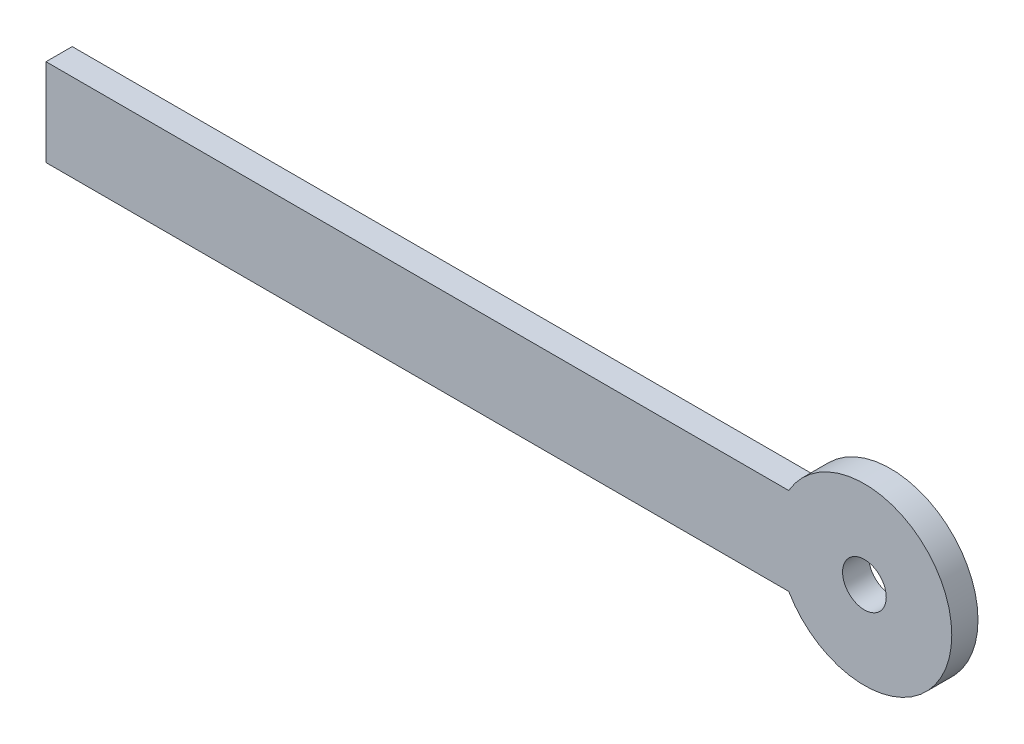
ISO-10303-21;
HEADER;
FILE_DESCRIPTION(('STEP AP214'),'2;1');
FILE_NAME('part.step','',(''),(''),'','','');
FILE_SCHEMA(('AUTOMOTIVE_DESIGN { 1 0 10303 214 1 1 1 1 }'));
ENDSEC;
DATA;
#1=APPLICATION_CONTEXT('core data for automotive mechanical design processes');
#2=APPLICATION_PROTOCOL_DEFINITION('international standard','automotive_design',2000,#1);
#3=PRODUCT_CONTEXT('',#1,'mechanical');
#4=PRODUCT('Part','Part','',(#3));
#5=PRODUCT_RELATED_PRODUCT_CATEGORY('part','',(#4));
#6=PRODUCT_DEFINITION_FORMATION('','',#4);
#7=PRODUCT_DEFINITION_CONTEXT('part definition',#1,'design');
#8=PRODUCT_DEFINITION('design','',#6,#7);
#9=PRODUCT_DEFINITION_SHAPE('','',#8);
#10=(LENGTH_UNIT() NAMED_UNIT(*) SI_UNIT(.MILLI.,.METRE.));
#11=(NAMED_UNIT(*) PLANE_ANGLE_UNIT() SI_UNIT($,.RADIAN.));
#12=(NAMED_UNIT(*) SI_UNIT($,.STERADIAN.) SOLID_ANGLE_UNIT());
#13=UNCERTAINTY_MEASURE_WITH_UNIT(LENGTH_MEASURE(1.E-05),#10,'distance_accuracy_value','');
#14=(GEOMETRIC_REPRESENTATION_CONTEXT(3) GLOBAL_UNCERTAINTY_ASSIGNED_CONTEXT((#13)) GLOBAL_UNIT_ASSIGNED_CONTEXT((#10,
#11,#12)) REPRESENTATION_CONTEXT('',''));
#15=CARTESIAN_POINT('',(0.,0.,0.));
#16=DIRECTION('',(0.,0.,1.));
#17=DIRECTION('',(1.,0.,0.));
#18=AXIS2_PLACEMENT_3D('',#15,#16,#17);
#19=CARTESIAN_POINT('',(0.,0.,3.));
#20=DIRECTION('',(0.,0.,1.));
#21=DIRECTION('',(1.,0.,0.));
#22=AXIS2_PLACEMENT_3D('',#19,#20,#21);
#23=PLANE('',#22);
#24=DIRECTION('',(0.,-1.,0.));
#25=VECTOR('',#24,1.);
#26=CARTESIAN_POINT('',(-93.6602540378444,4.99999999999999,3.));
#27=LINE('',#26,#25);
#28=CARTESIAN_POINT('',(-93.6602540378444,4.99999999999999,3.));
#29=VERTEX_POINT('',#28);
#30=CARTESIAN_POINT('',(-93.6602540378444,-5.00000000000001,3.));
#31=VERTEX_POINT('',#30);
#32=EDGE_CURVE('E85',#29,#31,#27,.T.);
#33=ORIENTED_EDGE('',*,*,#32,.T.);
#34=DIRECTION('',(1.,0.,0.));
#35=VECTOR('',#34,1.);
#36=CARTESIAN_POINT('',(-93.6602540378444,-5.00000000000001,3.));
#37=LINE('',#36,#35);
#38=CARTESIAN_POINT('',(-8.66025403784438,-5.,3.));
#39=VERTEX_POINT('',#38);
#40=EDGE_CURVE('E80',#31,#39,#37,.T.);
#41=ORIENTED_EDGE('',*,*,#40,.T.);
#42=CARTESIAN_POINT('',(0.,0.,3.));
#43=DIRECTION('',(0.,0.,1.));
#44=DIRECTION('',(1.,0.,0.));
#45=AXIS2_PLACEMENT_3D('',#42,#43,#44);
#46=CIRCLE('',#45,10.);
#47=CARTESIAN_POINT('',(-8.66025403784439,4.99999999999999,3.));
#48=VERTEX_POINT('',#47);
#49=EDGE_CURVE('E83',#39,#48,#46,.T.);
#50=ORIENTED_EDGE('',*,*,#49,.T.);
#51=DIRECTION('',(-1.,0.,0.));
#52=VECTOR('',#51,1.);
#53=CARTESIAN_POINT('',(-93.6602540378444,4.99999999999999,3.));
#54=LINE('',#53,#52);
#55=EDGE_CURVE('E50',#48,#29,#54,.T.);
#56=ORIENTED_EDGE('',*,*,#55,.T.);
#57=EDGE_LOOP('',(#33,#41,#50,#56));
#58=FACE_BOUND('',#57,.T.);
#59=CARTESIAN_POINT('',(0.,0.,3.));
#60=DIRECTION('',(0.,0.,1.));
#61=DIRECTION('',(1.,0.,0.));
#62=AXIS2_PLACEMENT_3D('',#59,#60,#61);
#63=CIRCLE('',#62,2.5);
#64=CARTESIAN_POINT('',(2.5,0.,3.));
#65=VERTEX_POINT('',#64);
#66=EDGE_CURVE('E100',#65,#65,#63,.T.);
#67=ORIENTED_EDGE('',*,*,#66,.F.);
#68=EDGE_LOOP('',(#67));
#69=FACE_BOUND('',#68,.T.);
#70=ADVANCED_FACE('F33',(#58,#69),#23,.T.);
#71=CARTESIAN_POINT('',(0.,0.,0.));
#72=DIRECTION('',(0.,0.,1.));
#73=DIRECTION('',(1.,0.,0.));
#74=AXIS2_PLACEMENT_3D('',#71,#72,#73);
#75=PLANE('',#74);
#76=DIRECTION('',(0.,-1.,0.));
#77=VECTOR('',#76,1.);
#78=CARTESIAN_POINT('',(-93.6602540378444,4.99999999999999,0.));
#79=LINE('',#78,#77);
#80=CARTESIAN_POINT('',(-93.6602540378444,4.99999999999999,0.));
#81=VERTEX_POINT('',#80);
#82=CARTESIAN_POINT('',(-93.6602540378444,-5.00000000000001,0.));
#83=VERTEX_POINT('',#82);
#84=EDGE_CURVE('E97',#81,#83,#79,.T.);
#85=ORIENTED_EDGE('',*,*,#84,.F.);
#86=DIRECTION('',(-1.,0.,0.));
#87=VECTOR('',#86,1.);
#88=CARTESIAN_POINT('',(-93.6602540378444,4.99999999999999,0.));
#89=LINE('',#88,#87);
#90=CARTESIAN_POINT('',(-8.66025403784439,4.99999999999999,0.));
#91=VERTEX_POINT('',#90);
#92=EDGE_CURVE('E73',#91,#81,#89,.T.);
#93=ORIENTED_EDGE('',*,*,#92,.F.);
#94=CARTESIAN_POINT('',(0.,0.,0.));
#95=DIRECTION('',(0.,0.,1.));
#96=DIRECTION('',(1.,0.,0.));
#97=AXIS2_PLACEMENT_3D('',#94,#95,#96);
#98=CIRCLE('',#97,10.);
#99=CARTESIAN_POINT('',(-8.66025403784438,-5.,0.));
#100=VERTEX_POINT('',#99);
#101=EDGE_CURVE('E67',#100,#91,#98,.T.);
#102=ORIENTED_EDGE('',*,*,#101,.F.);
#103=DIRECTION('',(1.,0.,0.));
#104=VECTOR('',#103,1.);
#105=CARTESIAN_POINT('',(-93.6602540378444,-5.00000000000001,0.));
#106=LINE('',#105,#104);
#107=EDGE_CURVE('E89',#83,#100,#106,.T.);
#108=ORIENTED_EDGE('',*,*,#107,.F.);
#109=EDGE_LOOP('',(#85,#93,#102,#108));
#110=FACE_BOUND('',#109,.T.);
#111=CARTESIAN_POINT('',(0.,0.,0.));
#112=DIRECTION('',(0.,0.,1.));
#113=DIRECTION('',(1.,0.,0.));
#114=AXIS2_PLACEMENT_3D('',#111,#112,#113);
#115=CIRCLE('',#114,2.5);
#116=CARTESIAN_POINT('',(2.5,0.,0.));
#117=VERTEX_POINT('',#116);
#118=EDGE_CURVE('E112',#117,#117,#115,.T.);
#119=ORIENTED_EDGE('',*,*,#118,.T.);
#120=EDGE_LOOP('',(#119));
#121=FACE_BOUND('',#120,.T.);
#122=ADVANCED_FACE('F108',(#110,#121),#75,.F.);
#123=CARTESIAN_POINT('',(-93.6602540378444,4.99999999999999,3.));
#124=DIRECTION('',(1.,0.,0.));
#125=DIRECTION('',(0.,0.,-1.));
#126=AXIS2_PLACEMENT_3D('',#123,#124,#125);
#127=PLANE('',#126);
#128=ORIENTED_EDGE('',*,*,#84,.T.);
#129=DIRECTION('',(0.,0.,-1.));
#130=VECTOR('',#129,1.);
#131=CARTESIAN_POINT('',(-93.6602540378444,-5.00000000000001,3.));
#132=LINE('',#131,#130);
#133=EDGE_CURVE('E11',#31,#83,#132,.T.);
#134=ORIENTED_EDGE('',*,*,#133,.F.);
#135=ORIENTED_EDGE('',*,*,#32,.F.);
#136=DIRECTION('',(0.,0.,-1.));
#137=VECTOR('',#136,1.);
#138=CARTESIAN_POINT('',(-93.6602540378444,4.99999999999999,3.));
#139=LINE('',#138,#137);
#140=EDGE_CURVE('E93',#29,#81,#139,.T.);
#141=ORIENTED_EDGE('',*,*,#140,.T.);
#142=EDGE_LOOP('',(#128,#134,#135,#141));
#143=FACE_BOUND('',#142,.T.);
#144=ADVANCED_FACE('F35',(#143),#127,.F.);
#145=CARTESIAN_POINT('',(-93.6602540378444,-5.00000000000001,3.));
#146=DIRECTION('',(0.,1.,0.));
#147=DIRECTION('',(-1.,0.,0.));
#148=AXIS2_PLACEMENT_3D('',#145,#146,#147);
#149=PLANE('',#148);
#150=ORIENTED_EDGE('',*,*,#107,.T.);
#151=DIRECTION('',(0.,0.,-1.));
#152=VECTOR('',#151,1.);
#153=CARTESIAN_POINT('',(-8.66025403784438,-5.,3.));
#154=LINE('',#153,#152);
#155=EDGE_CURVE('E42',#39,#100,#154,.T.);
#156=ORIENTED_EDGE('',*,*,#155,.F.);
#157=ORIENTED_EDGE('',*,*,#40,.F.);
#158=ORIENTED_EDGE('',*,*,#133,.T.);
#159=EDGE_LOOP('',(#150,#156,#157,#158));
#160=FACE_BOUND('',#159,.T.);
#161=ADVANCED_FACE('F88',(#160),#149,.F.);
#162=CARTESIAN_POINT('',(0.,0.,3.));
#163=DIRECTION('',(0.,0.,-1.));
#164=DIRECTION('',(-1.,0.,0.));
#165=AXIS2_PLACEMENT_3D('',#162,#163,#164);
#166=CYLINDRICAL_SURFACE('',#165,10.);
#167=ORIENTED_EDGE('',*,*,#101,.T.);
#168=DIRECTION('',(0.,0.,-1.));
#169=VECTOR('',#168,1.);
#170=CARTESIAN_POINT('',(-8.66025403784439,4.99999999999999,3.));
#171=LINE('',#170,#169);
#172=EDGE_CURVE('E90',#48,#91,#171,.T.);
#173=ORIENTED_EDGE('',*,*,#172,.F.);
#174=ORIENTED_EDGE('',*,*,#49,.F.);
#175=ORIENTED_EDGE('',*,*,#155,.T.);
#176=EDGE_LOOP('',(#167,#173,#174,#175));
#177=FACE_BOUND('',#176,.T.);
#178=ADVANCED_FACE('F91',(#177),#166,.T.);
#179=CARTESIAN_POINT('',(-93.6602540378444,4.99999999999999,3.));
#180=DIRECTION('',(0.,-1.,0.));
#181=DIRECTION('',(1.,0.,0.));
#182=AXIS2_PLACEMENT_3D('',#179,#180,#181);
#183=PLANE('',#182);
#184=ORIENTED_EDGE('',*,*,#92,.T.);
#185=ORIENTED_EDGE('',*,*,#140,.F.);
#186=ORIENTED_EDGE('',*,*,#55,.F.);
#187=ORIENTED_EDGE('',*,*,#172,.T.);
#188=EDGE_LOOP('',(#184,#185,#186,#187));
#189=FACE_BOUND('',#188,.T.);
#190=ADVANCED_FACE('F105',(#189),#183,.F.);
#191=CARTESIAN_POINT('',(0.,0.,3.));
#192=DIRECTION('',(0.,0.,-1.));
#193=DIRECTION('',(-1.,0.,0.));
#194=AXIS2_PLACEMENT_3D('',#191,#192,#193);
#195=CYLINDRICAL_SURFACE('',#194,2.5);
#196=ORIENTED_EDGE('',*,*,#66,.T.);
#197=EDGE_LOOP('',(#196));
#198=FACE_BOUND('',#197,.T.);
#199=ORIENTED_EDGE('',*,*,#118,.F.);
#200=EDGE_LOOP('',(#199));
#201=FACE_BOUND('',#200,.T.);
#202=ADVANCED_FACE('F118',(#198,#201),#195,.F.);
#203=CLOSED_SHELL('',(#70,#122,#144,#161,#178,#190,#202));
#204=MANIFOLD_SOLID_BREP('B2',#203);
#205=ADVANCED_BREP_SHAPE_REPRESENTATION('',(#18,#204),#14);
#206=SHAPE_DEFINITION_REPRESENTATION(#9,#205);
ENDSEC;
END-ISO-10303-21;
